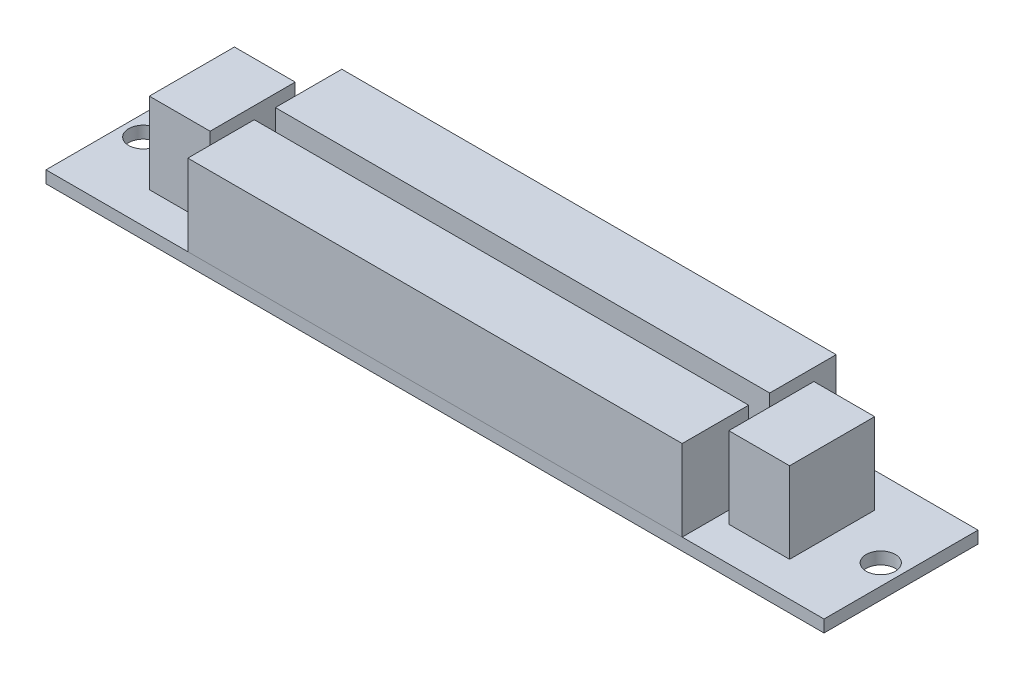
ISO-10303-21;
HEADER;
FILE_DESCRIPTION(('STEP AP214'),'2;1');
FILE_NAME('part.step','',(''),(''),'','','');
FILE_SCHEMA(('AUTOMOTIVE_DESIGN { 1 0 10303 214 1 1 1 1 }'));
ENDSEC;
DATA;
#1=APPLICATION_CONTEXT('core data for automotive mechanical design processes');
#2=APPLICATION_PROTOCOL_DEFINITION('international standard','automotive_design',2000,#1);
#3=PRODUCT_CONTEXT('',#1,'mechanical');
#4=PRODUCT('Part','Part','',(#3));
#5=PRODUCT_RELATED_PRODUCT_CATEGORY('part','',(#4));
#6=PRODUCT_DEFINITION_FORMATION('','',#4);
#7=PRODUCT_DEFINITION_CONTEXT('part definition',#1,'design');
#8=PRODUCT_DEFINITION('design','',#6,#7);
#9=PRODUCT_DEFINITION_SHAPE('','',#8);
#10=(LENGTH_UNIT() NAMED_UNIT(*) SI_UNIT(.MILLI.,.METRE.));
#11=(NAMED_UNIT(*) PLANE_ANGLE_UNIT() SI_UNIT($,.RADIAN.));
#12=(NAMED_UNIT(*) SI_UNIT($,.STERADIAN.) SOLID_ANGLE_UNIT());
#13=UNCERTAINTY_MEASURE_WITH_UNIT(LENGTH_MEASURE(1.E-05),#10,'distance_accuracy_value','');
#14=(GEOMETRIC_REPRESENTATION_CONTEXT(3) GLOBAL_UNCERTAINTY_ASSIGNED_CONTEXT((#13)) GLOBAL_UNIT_ASSIGNED_CONTEXT((#10,
#11,#12)) REPRESENTATION_CONTEXT('',''));
#15=CARTESIAN_POINT('',(0.,0.,0.));
#16=DIRECTION('',(0.,0.,1.));
#17=DIRECTION('',(1.,0.,0.));
#18=AXIS2_PLACEMENT_3D('',#15,#16,#17);
#19=CARTESIAN_POINT('',(8.5,11.5,-19.));
#20=DIRECTION('',(0.,0.,1.));
#21=DIRECTION('',(1.,0.,0.));
#22=AXIS2_PLACEMENT_3D('',#19,#20,#21);
#23=PLANE('',#22);
#24=DIRECTION('',(0.,1.,0.));
#25=VECTOR('',#24,1.);
#26=CARTESIAN_POINT('',(17.5,1.5,-19.));
#27=LINE('',#26,#25);
#28=CARTESIAN_POINT('',(17.5,1.5,-19.));
#29=VERTEX_POINT('',#28);
#30=CARTESIAN_POINT('',(17.5,11.5,-19.));
#31=VERTEX_POINT('',#30);
#32=EDGE_CURVE('E97',#29,#31,#27,.T.);
#33=ORIENTED_EDGE('',*,*,#32,.T.);
#34=DIRECTION('',(-1.,0.,0.));
#35=VECTOR('',#34,1.);
#36=CARTESIAN_POINT('',(8.5,11.5,-19.));
#37=LINE('',#36,#35);
#38=CARTESIAN_POINT('',(78.5,11.5,-19.));
#39=VERTEX_POINT('',#38);
#40=EDGE_CURVE('E102',#39,#31,#37,.T.);
#41=ORIENTED_EDGE('',*,*,#40,.F.);
#42=DIRECTION('',(0.,1.,0.));
#43=VECTOR('',#42,1.);
#44=CARTESIAN_POINT('',(78.5,1.5,-19.));
#45=LINE('',#44,#43);
#46=CARTESIAN_POINT('',(78.5,1.5,-19.));
#47=VERTEX_POINT('',#46);
#48=EDGE_CURVE('E12',#47,#39,#45,.T.);
#49=ORIENTED_EDGE('',*,*,#48,.F.);
#50=DIRECTION('',(-1.,0.,0.));
#51=VECTOR('',#50,1.);
#52=CARTESIAN_POINT('',(8.5,1.5,-19.));
#53=LINE('',#52,#51);
#54=EDGE_CURVE('E107',#47,#29,#53,.T.);
#55=ORIENTED_EDGE('',*,*,#54,.T.);
#56=EDGE_LOOP('',(#33,#41,#49,#55));
#57=FACE_BOUND('',#56,.T.);
#58=ADVANCED_FACE('F54',(#57),#23,.F.);
#59=CARTESIAN_POINT('',(0.,11.5,0.));
#60=DIRECTION('',(0.,1.,0.));
#61=DIRECTION('',(0.,0.,1.));
#62=AXIS2_PLACEMENT_3D('',#59,#60,#61);
#63=PLANE('',#62);
#64=ORIENTED_EDGE('',*,*,#40,.T.);
#65=DIRECTION('',(0.,0.,1.));
#66=VECTOR('',#65,1.);
#67=CARTESIAN_POINT('',(17.5,11.5,0.));
#68=LINE('',#67,#66);
#69=CARTESIAN_POINT('',(17.5,11.5,-10.8));
#70=VERTEX_POINT('',#69);
#71=EDGE_CURVE('E58',#31,#70,#68,.T.);
#72=ORIENTED_EDGE('',*,*,#71,.T.);
#73=DIRECTION('',(-1.,0.,0.));
#74=VECTOR('',#73,1.);
#75=CARTESIAN_POINT('',(0.,11.5,-10.8));
#76=LINE('',#75,#74);
#77=CARTESIAN_POINT('',(78.5,11.5,-10.8));
#78=VERTEX_POINT('',#77);
#79=EDGE_CURVE('E116',#78,#70,#76,.T.);
#80=ORIENTED_EDGE('',*,*,#79,.F.);
#81=DIRECTION('',(0.,0.,1.));
#82=VECTOR('',#81,1.);
#83=CARTESIAN_POINT('',(78.5,11.5,0.));
#84=LINE('',#83,#82);
#85=EDGE_CURVE('E64',#39,#78,#84,.T.);
#86=ORIENTED_EDGE('',*,*,#85,.F.);
#87=EDGE_LOOP('',(#64,#72,#80,#86));
#88=FACE_BOUND('',#87,.T.);
#89=ADVANCED_FACE('F109',(#88),#63,.T.);
#90=CARTESIAN_POINT('',(0.,1.5,0.));
#91=DIRECTION('',(0.,1.,0.));
#92=DIRECTION('',(0.,0.,1.));
#93=AXIS2_PLACEMENT_3D('',#90,#91,#92);
#94=PLANE('',#93);
#95=DIRECTION('',(0.,0.,1.));
#96=VECTOR('',#95,1.);
#97=CARTESIAN_POINT('',(17.5,1.5,0.));
#98=LINE('',#97,#96);
#99=CARTESIAN_POINT('',(17.5,1.5,-10.8));
#100=VERTEX_POINT('',#99);
#101=EDGE_CURVE('E85',#29,#100,#98,.T.);
#102=ORIENTED_EDGE('',*,*,#101,.F.);
#103=ORIENTED_EDGE('',*,*,#54,.F.);
#104=DIRECTION('',(0.,0.,1.));
#105=VECTOR('',#104,1.);
#106=CARTESIAN_POINT('',(78.5,1.5,0.));
#107=LINE('',#106,#105);
#108=CARTESIAN_POINT('',(78.5,1.5,-10.8));
#109=VERTEX_POINT('',#108);
#110=EDGE_CURVE('E101',#47,#109,#107,.T.);
#111=ORIENTED_EDGE('',*,*,#110,.T.);
#112=DIRECTION('',(-1.,0.,0.));
#113=VECTOR('',#112,1.);
#114=CARTESIAN_POINT('',(0.,1.5,-10.8));
#115=LINE('',#114,#113);
#116=EDGE_CURVE('E119',#109,#100,#115,.T.);
#117=ORIENTED_EDGE('',*,*,#116,.T.);
#118=EDGE_LOOP('',(#102,#103,#111,#117));
#119=FACE_BOUND('',#118,.T.);
#120=ADVANCED_FACE('F56',(#119),#94,.F.);
#121=CARTESIAN_POINT('',(17.5,1.5,0.));
#122=DIRECTION('',(-1.,0.,0.));
#123=DIRECTION('',(0.,0.,1.));
#124=AXIS2_PLACEMENT_3D('',#121,#122,#123);
#125=PLANE('',#124);
#126=ORIENTED_EDGE('',*,*,#71,.F.);
#127=ORIENTED_EDGE('',*,*,#32,.F.);
#128=ORIENTED_EDGE('',*,*,#101,.T.);
#129=DIRECTION('',(0.,1.,0.));
#130=VECTOR('',#129,1.);
#131=CARTESIAN_POINT('',(17.5,1.5,-10.8));
#132=LINE('',#131,#130);
#133=EDGE_CURVE('E89',#100,#70,#132,.T.);
#134=ORIENTED_EDGE('',*,*,#133,.T.);
#135=EDGE_LOOP('',(#126,#127,#128,#134));
#136=FACE_BOUND('',#135,.T.);
#137=ADVANCED_FACE('F96',(#136),#125,.T.);
#138=CARTESIAN_POINT('',(0.,1.5,-10.8));
#139=DIRECTION('',(0.,0.,-1.));
#140=DIRECTION('',(-1.,0.,0.));
#141=AXIS2_PLACEMENT_3D('',#138,#139,#140);
#142=PLANE('',#141);
#143=ORIENTED_EDGE('',*,*,#79,.T.);
#144=ORIENTED_EDGE('',*,*,#133,.F.);
#145=ORIENTED_EDGE('',*,*,#116,.F.);
#146=DIRECTION('',(0.,1.,0.));
#147=VECTOR('',#146,1.);
#148=CARTESIAN_POINT('',(78.5,1.5,-10.8));
#149=LINE('',#148,#147);
#150=EDGE_CURVE('E113',#109,#78,#149,.T.);
#151=ORIENTED_EDGE('',*,*,#150,.T.);
#152=EDGE_LOOP('',(#143,#144,#145,#151));
#153=FACE_BOUND('',#152,.T.);
#154=ADVANCED_FACE('F128',(#153),#142,.F.);
#155=CARTESIAN_POINT('',(78.5,1.5,0.));
#156=DIRECTION('',(-1.,0.,0.));
#157=DIRECTION('',(0.,0.,1.));
#158=AXIS2_PLACEMENT_3D('',#155,#156,#157);
#159=PLANE('',#158);
#160=ORIENTED_EDGE('',*,*,#85,.T.);
#161=ORIENTED_EDGE('',*,*,#150,.F.);
#162=ORIENTED_EDGE('',*,*,#110,.F.);
#163=ORIENTED_EDGE('',*,*,#48,.T.);
#164=EDGE_LOOP('',(#160,#161,#162,#163));
#165=FACE_BOUND('',#164,.T.);
#166=ADVANCED_FACE('F126',(#165),#159,.F.);
#167=CLOSED_SHELL('',(#58,#89,#120,#137,#154,#166));
#168=MANIFOLD_SOLID_BREP('B2',#167);
#169=CARTESIAN_POINT('',(0.,11.5,0.));
#170=DIRECTION('',(0.,1.,0.));
#171=DIRECTION('',(0.,0.,1.));
#172=AXIS2_PLACEMENT_3D('',#169,#170,#171);
#173=PLANE('',#172);
#174=DIRECTION('',(0.,0.,-1.));
#175=VECTOR('',#174,1.);
#176=CARTESIAN_POINT('',(16.,11.5,0.));
#177=LINE('',#176,#175);
#178=CARTESIAN_POINT('',(16.,11.5,-4.25));
#179=VERTEX_POINT('',#178);
#180=CARTESIAN_POINT('',(16.,11.5,-14.75));
#181=VERTEX_POINT('',#180);
#182=EDGE_CURVE('E252',#179,#181,#177,.T.);
#183=ORIENTED_EDGE('',*,*,#182,.T.);
#184=DIRECTION('',(-1.,0.,0.));
#185=VECTOR('',#184,1.);
#186=CARTESIAN_POINT('',(0.,11.5,-14.75));
#187=LINE('',#186,#185);
#188=CARTESIAN_POINT('',(8.5,11.5,-14.75));
#189=VERTEX_POINT('',#188);
#190=EDGE_CURVE('E261',#181,#189,#187,.T.);
#191=ORIENTED_EDGE('',*,*,#190,.T.);
#192=DIRECTION('',(0.,0.,1.));
#193=VECTOR('',#192,1.);
#194=CARTESIAN_POINT('',(8.5,11.5,-19.));
#195=LINE('',#194,#193);
#196=CARTESIAN_POINT('',(8.5,11.5,-4.25));
#197=VERTEX_POINT('',#196);
#198=EDGE_CURVE('E244',#189,#197,#195,.T.);
#199=ORIENTED_EDGE('',*,*,#198,.T.);
#200=DIRECTION('',(-1.,0.,0.));
#201=VECTOR('',#200,1.);
#202=CARTESIAN_POINT('',(0.,11.5,-4.25));
#203=LINE('',#202,#201);
#204=EDGE_CURVE('E254',#179,#197,#203,.T.);
#205=ORIENTED_EDGE('',*,*,#204,.F.);
#206=EDGE_LOOP('',(#183,#191,#199,#205));
#207=FACE_BOUND('',#206,.T.);
#208=ADVANCED_FACE('F197',(#207),#173,.T.);
#209=CARTESIAN_POINT('',(0.,1.5,0.));
#210=DIRECTION('',(0.,1.,0.));
#211=DIRECTION('',(0.,0.,1.));
#212=AXIS2_PLACEMENT_3D('',#209,#210,#211);
#213=PLANE('',#212);
#214=DIRECTION('',(-1.,0.,0.));
#215=VECTOR('',#214,1.);
#216=CARTESIAN_POINT('',(0.,1.5,-14.75));
#217=LINE('',#216,#215);
#218=CARTESIAN_POINT('',(16.,1.5,-14.75));
#219=VERTEX_POINT('',#218);
#220=CARTESIAN_POINT('',(8.5,1.5,-14.75));
#221=VERTEX_POINT('',#220);
#222=EDGE_CURVE('E201',#219,#221,#217,.T.);
#223=ORIENTED_EDGE('',*,*,#222,.F.);
#224=DIRECTION('',(0.,0.,-1.));
#225=VECTOR('',#224,1.);
#226=CARTESIAN_POINT('',(16.,1.5,0.));
#227=LINE('',#226,#225);
#228=CARTESIAN_POINT('',(16.,1.5,-4.25));
#229=VERTEX_POINT('',#228);
#230=EDGE_CURVE('E249',#229,#219,#227,.T.);
#231=ORIENTED_EDGE('',*,*,#230,.F.);
#232=DIRECTION('',(-1.,0.,0.));
#233=VECTOR('',#232,1.);
#234=CARTESIAN_POINT('',(0.,1.5,-4.25));
#235=LINE('',#234,#233);
#236=CARTESIAN_POINT('',(8.5,1.5,-4.25));
#237=VERTEX_POINT('',#236);
#238=EDGE_CURVE('E234',#229,#237,#235,.T.);
#239=ORIENTED_EDGE('',*,*,#238,.T.);
#240=DIRECTION('',(0.,0.,1.));
#241=VECTOR('',#240,1.);
#242=CARTESIAN_POINT('',(8.5,1.5,-19.));
#243=LINE('',#242,#241);
#244=EDGE_CURVE('E243',#221,#237,#243,.T.);
#245=ORIENTED_EDGE('',*,*,#244,.F.);
#246=EDGE_LOOP('',(#223,#231,#239,#245));
#247=FACE_BOUND('',#246,.T.);
#248=ADVANCED_FACE('F199',(#247),#213,.F.);
#249=CARTESIAN_POINT('',(8.5,11.5,-19.));
#250=DIRECTION('',(1.,0.,0.));
#251=DIRECTION('',(0.,0.,-1.));
#252=AXIS2_PLACEMENT_3D('',#249,#250,#251);
#253=PLANE('',#252);
#254=DIRECTION('',(0.,1.,0.));
#255=VECTOR('',#254,1.);
#256=CARTESIAN_POINT('',(8.5,1.5,-14.75));
#257=LINE('',#256,#255);
#258=EDGE_CURVE('E52',#221,#189,#257,.T.);
#259=ORIENTED_EDGE('',*,*,#258,.F.);
#260=ORIENTED_EDGE('',*,*,#244,.T.);
#261=DIRECTION('',(0.,1.,0.));
#262=VECTOR('',#261,1.);
#263=CARTESIAN_POINT('',(8.5,1.5,-4.25));
#264=LINE('',#263,#262);
#265=EDGE_CURVE('E232',#237,#197,#264,.T.);
#266=ORIENTED_EDGE('',*,*,#265,.T.);
#267=ORIENTED_EDGE('',*,*,#198,.F.);
#268=EDGE_LOOP('',(#259,#260,#266,#267));
#269=FACE_BOUND('',#268,.T.);
#270=ADVANCED_FACE('F268',(#269),#253,.F.);
#271=CARTESIAN_POINT('',(16.,1.5,0.));
#272=DIRECTION('',(1.,0.,0.));
#273=DIRECTION('',(0.,0.,-1.));
#274=AXIS2_PLACEMENT_3D('',#271,#272,#273);
#275=PLANE('',#274);
#276=ORIENTED_EDGE('',*,*,#182,.F.);
#277=DIRECTION('',(0.,1.,0.));
#278=VECTOR('',#277,1.);
#279=CARTESIAN_POINT('',(16.,1.5,-4.25));
#280=LINE('',#279,#278);
#281=EDGE_CURVE('E237',#229,#179,#280,.T.);
#282=ORIENTED_EDGE('',*,*,#281,.F.);
#283=ORIENTED_EDGE('',*,*,#230,.T.);
#284=DIRECTION('',(0.,1.,0.));
#285=VECTOR('',#284,1.);
#286=CARTESIAN_POINT('',(16.,1.5,-14.75));
#287=LINE('',#286,#285);
#288=EDGE_CURVE('E257',#219,#181,#287,.T.);
#289=ORIENTED_EDGE('',*,*,#288,.T.);
#290=EDGE_LOOP('',(#276,#282,#283,#289));
#291=FACE_BOUND('',#290,.T.);
#292=ADVANCED_FACE('F248',(#291),#275,.T.);
#293=CARTESIAN_POINT('',(0.,1.5,-4.25));
#294=DIRECTION('',(0.,0.,-1.));
#295=DIRECTION('',(-1.,0.,0.));
#296=AXIS2_PLACEMENT_3D('',#293,#294,#295);
#297=PLANE('',#296);
#298=ORIENTED_EDGE('',*,*,#204,.T.);
#299=ORIENTED_EDGE('',*,*,#265,.F.);
#300=ORIENTED_EDGE('',*,*,#238,.F.);
#301=ORIENTED_EDGE('',*,*,#281,.T.);
#302=EDGE_LOOP('',(#298,#299,#300,#301));
#303=FACE_BOUND('',#302,.T.);
#304=ADVANCED_FACE('F236',(#303),#297,.F.);
#305=CARTESIAN_POINT('',(0.,1.5,-14.75));
#306=DIRECTION('',(0.,0.,-1.));
#307=DIRECTION('',(-1.,0.,0.));
#308=AXIS2_PLACEMENT_3D('',#305,#306,#307);
#309=PLANE('',#308);
#310=ORIENTED_EDGE('',*,*,#190,.F.);
#311=ORIENTED_EDGE('',*,*,#288,.F.);
#312=ORIENTED_EDGE('',*,*,#222,.T.);
#313=ORIENTED_EDGE('',*,*,#258,.T.);
#314=EDGE_LOOP('',(#310,#311,#312,#313));
#315=FACE_BOUND('',#314,.T.);
#316=ADVANCED_FACE('F271',(#315),#309,.T.);
#317=CLOSED_SHELL('',(#208,#248,#270,#292,#304,#316));
#318=MANIFOLD_SOLID_BREP('B6',#317);
#319=CARTESIAN_POINT('',(0.,11.5,0.));
#320=DIRECTION('',(0.,1.,0.));
#321=DIRECTION('',(0.,0.,1.));
#322=AXIS2_PLACEMENT_3D('',#319,#320,#321);
#323=PLANE('',#322);
#324=DIRECTION('',(0.,0.,1.));
#325=VECTOR('',#324,1.);
#326=CARTESIAN_POINT('',(78.5,11.5,0.));
#327=LINE('',#326,#325);
#328=CARTESIAN_POINT('',(78.5,11.5,-8.2));
#329=VERTEX_POINT('',#328);
#330=CARTESIAN_POINT('',(78.5,11.5,0.));
#331=VERTEX_POINT('',#330);
#332=EDGE_CURVE('E347',#329,#331,#327,.T.);
#333=ORIENTED_EDGE('',*,*,#332,.F.);
#334=DIRECTION('',(-1.,0.,0.));
#335=VECTOR('',#334,1.);
#336=CARTESIAN_POINT('',(0.,11.5,-8.2));
#337=LINE('',#336,#335);
#338=CARTESIAN_POINT('',(17.5,11.5,-8.2));
#339=VERTEX_POINT('',#338);
#340=EDGE_CURVE('E376',#329,#339,#337,.T.);
#341=ORIENTED_EDGE('',*,*,#340,.T.);
#342=DIRECTION('',(0.,0.,1.));
#343=VECTOR('',#342,1.);
#344=CARTESIAN_POINT('',(17.5,11.5,0.));
#345=LINE('',#344,#343);
#346=CARTESIAN_POINT('',(17.5,11.5,0.));
#347=VERTEX_POINT('',#346);
#348=EDGE_CURVE('E395',#339,#347,#345,.T.);
#349=ORIENTED_EDGE('',*,*,#348,.T.);
#350=DIRECTION('',(1.,0.,0.));
#351=VECTOR('',#350,1.);
#352=CARTESIAN_POINT('',(8.5,11.5,0.));
#353=LINE('',#352,#351);
#354=EDGE_CURVE('E386',#347,#331,#353,.T.);
#355=ORIENTED_EDGE('',*,*,#354,.T.);
#356=EDGE_LOOP('',(#333,#341,#349,#355));
#357=FACE_BOUND('',#356,.T.);
#358=ADVANCED_FACE('F337',(#357),#323,.T.);
#359=CARTESIAN_POINT('',(0.,1.5,0.));
#360=DIRECTION('',(0.,1.,0.));
#361=DIRECTION('',(0.,0.,1.));
#362=AXIS2_PLACEMENT_3D('',#359,#360,#361);
#363=PLANE('',#362);
#364=DIRECTION('',(-1.,0.,0.));
#365=VECTOR('',#364,1.);
#366=CARTESIAN_POINT('',(0.,1.5,-8.2));
#367=LINE('',#366,#365);
#368=CARTESIAN_POINT('',(78.5,1.5,-8.2));
#369=VERTEX_POINT('',#368);
#370=CARTESIAN_POINT('',(17.5,1.5,-8.2));
#371=VERTEX_POINT('',#370);
#372=EDGE_CURVE('E373',#369,#371,#367,.T.);
#373=ORIENTED_EDGE('',*,*,#372,.F.);
#374=DIRECTION('',(0.,0.,1.));
#375=VECTOR('',#374,1.);
#376=CARTESIAN_POINT('',(78.5,1.5,0.));
#377=LINE('',#376,#375);
#378=CARTESIAN_POINT('',(78.5,1.5,0.));
#379=VERTEX_POINT('',#378);
#380=EDGE_CURVE('E379',#369,#379,#377,.T.);
#381=ORIENTED_EDGE('',*,*,#380,.T.);
#382=DIRECTION('',(1.,0.,0.));
#383=VECTOR('',#382,1.);
#384=CARTESIAN_POINT('',(8.5,1.5,0.));
#385=LINE('',#384,#383);
#386=CARTESIAN_POINT('',(17.5,1.5,0.));
#387=VERTEX_POINT('',#386);
#388=EDGE_CURVE('E385',#387,#379,#385,.T.);
#389=ORIENTED_EDGE('',*,*,#388,.F.);
#390=DIRECTION('',(0.,0.,1.));
#391=VECTOR('',#390,1.);
#392=CARTESIAN_POINT('',(17.5,1.5,0.));
#393=LINE('',#392,#391);
#394=EDGE_CURVE('E341',#371,#387,#393,.T.);
#395=ORIENTED_EDGE('',*,*,#394,.F.);
#396=EDGE_LOOP('',(#373,#381,#389,#395));
#397=FACE_BOUND('',#396,.T.);
#398=ADVANCED_FACE('F388',(#397),#363,.F.);
#399=CARTESIAN_POINT('',(8.5,11.5,0.));
#400=DIRECTION('',(0.,0.,-1.));
#401=DIRECTION('',(-1.,0.,0.));
#402=AXIS2_PLACEMENT_3D('',#399,#400,#401);
#403=PLANE('',#402);
#404=ORIENTED_EDGE('',*,*,#388,.T.);
#405=DIRECTION('',(0.,1.,0.));
#406=VECTOR('',#405,1.);
#407=CARTESIAN_POINT('',(78.5,1.5,0.));
#408=LINE('',#407,#406);
#409=EDGE_CURVE('E381',#379,#331,#408,.T.);
#410=ORIENTED_EDGE('',*,*,#409,.T.);
#411=ORIENTED_EDGE('',*,*,#354,.F.);
#412=DIRECTION('',(0.,1.,0.));
#413=VECTOR('',#412,1.);
#414=CARTESIAN_POINT('',(17.5,1.5,0.));
#415=LINE('',#414,#413);
#416=EDGE_CURVE('E391',#387,#347,#415,.T.);
#417=ORIENTED_EDGE('',*,*,#416,.F.);
#418=EDGE_LOOP('',(#404,#410,#411,#417));
#419=FACE_BOUND('',#418,.T.);
#420=ADVANCED_FACE('F405',(#419),#403,.F.);
#421=CARTESIAN_POINT('',(17.5,1.5,0.));
#422=DIRECTION('',(-1.,0.,0.));
#423=DIRECTION('',(0.,0.,1.));
#424=AXIS2_PLACEMENT_3D('',#421,#422,#423);
#425=PLANE('',#424);
#426=ORIENTED_EDGE('',*,*,#348,.F.);
#427=DIRECTION('',(0.,1.,0.));
#428=VECTOR('',#427,1.);
#429=CARTESIAN_POINT('',(17.5,1.5,-8.2));
#430=LINE('',#429,#428);
#431=EDGE_CURVE('E390',#371,#339,#430,.T.);
#432=ORIENTED_EDGE('',*,*,#431,.F.);
#433=ORIENTED_EDGE('',*,*,#394,.T.);
#434=ORIENTED_EDGE('',*,*,#416,.T.);
#435=EDGE_LOOP('',(#426,#432,#433,#434));
#436=FACE_BOUND('',#435,.T.);
#437=ADVANCED_FACE('F410',(#436),#425,.T.);
#438=CARTESIAN_POINT('',(0.,1.5,-8.2));
#439=DIRECTION('',(0.,0.,-1.));
#440=DIRECTION('',(-1.,0.,0.));
#441=AXIS2_PLACEMENT_3D('',#438,#439,#440);
#442=PLANE('',#441);
#443=ORIENTED_EDGE('',*,*,#340,.F.);
#444=DIRECTION('',(0.,1.,0.));
#445=VECTOR('',#444,1.);
#446=CARTESIAN_POINT('',(78.5,1.5,-8.2));
#447=LINE('',#446,#445);
#448=EDGE_CURVE('E195',#369,#329,#447,.T.);
#449=ORIENTED_EDGE('',*,*,#448,.F.);
#450=ORIENTED_EDGE('',*,*,#372,.T.);
#451=ORIENTED_EDGE('',*,*,#431,.T.);
#452=EDGE_LOOP('',(#443,#449,#450,#451));
#453=FACE_BOUND('',#452,.T.);
#454=ADVANCED_FACE('F370',(#453),#442,.T.);
#455=CARTESIAN_POINT('',(78.5,1.5,0.));
#456=DIRECTION('',(-1.,0.,0.));
#457=DIRECTION('',(0.,0.,1.));
#458=AXIS2_PLACEMENT_3D('',#455,#456,#457);
#459=PLANE('',#458);
#460=ORIENTED_EDGE('',*,*,#332,.T.);
#461=ORIENTED_EDGE('',*,*,#409,.F.);
#462=ORIENTED_EDGE('',*,*,#380,.F.);
#463=ORIENTED_EDGE('',*,*,#448,.T.);
#464=EDGE_LOOP('',(#460,#461,#462,#463));
#465=FACE_BOUND('',#464,.T.);
#466=ADVANCED_FACE('F339',(#465),#459,.F.);
#467=CLOSED_SHELL('',(#358,#398,#420,#437,#454,#466));
#468=MANIFOLD_SOLID_BREP('B46',#467);
#469=CARTESIAN_POINT('',(0.,11.5,0.));
#470=DIRECTION('',(0.,1.,0.));
#471=DIRECTION('',(0.,0.,1.));
#472=AXIS2_PLACEMENT_3D('',#469,#470,#471);
#473=PLANE('',#472);
#474=DIRECTION('',(1.,0.,0.));
#475=VECTOR('',#474,1.);
#476=CARTESIAN_POINT('',(0.,11.5,-14.7500000000001));
#477=LINE('',#476,#475);
#478=CARTESIAN_POINT('',(80.,11.5,-14.75));
#479=VERTEX_POINT('',#478);
#480=CARTESIAN_POINT('',(87.5,11.5,-14.75));
#481=VERTEX_POINT('',#480);
#482=EDGE_CURVE('E519',#479,#481,#477,.T.);
#483=ORIENTED_EDGE('',*,*,#482,.F.);
#484=DIRECTION('',(0.,0.,1.));
#485=VECTOR('',#484,1.);
#486=CARTESIAN_POINT('',(80.,11.5,0.));
#487=LINE('',#486,#485);
#488=CARTESIAN_POINT('',(80.,11.5,-4.24999999999998));
#489=VERTEX_POINT('',#488);
#490=EDGE_CURVE('E547',#479,#489,#487,.T.);
#491=ORIENTED_EDGE('',*,*,#490,.T.);
#492=DIRECTION('',(1.,0.,0.));
#493=VECTOR('',#492,1.);
#494=CARTESIAN_POINT('',(0.,11.5,-4.25000000000002));
#495=LINE('',#494,#493);
#496=CARTESIAN_POINT('',(87.5,11.5,-4.24999999999997));
#497=VERTEX_POINT('',#496);
#498=EDGE_CURVE('E548',#489,#497,#495,.T.);
#499=ORIENTED_EDGE('',*,*,#498,.T.);
#500=DIRECTION('',(0.,0.,-1.));
#501=VECTOR('',#500,1.);
#502=CARTESIAN_POINT('',(87.5,11.5,-19.));
#503=LINE('',#502,#501);
#504=EDGE_CURVE('E335',#497,#481,#503,.T.);
#505=ORIENTED_EDGE('',*,*,#504,.T.);
#506=EDGE_LOOP('',(#483,#491,#499,#505));
#507=FACE_BOUND('',#506,.T.);
#508=ADVANCED_FACE('F479',(#507),#473,.T.);
#509=CARTESIAN_POINT('',(0.,1.5,0.));
#510=DIRECTION('',(0.,1.,0.));
#511=DIRECTION('',(0.,0.,1.));
#512=AXIS2_PLACEMENT_3D('',#509,#510,#511);
#513=PLANE('',#512);
#514=DIRECTION('',(0.,0.,1.));
#515=VECTOR('',#514,1.);
#516=CARTESIAN_POINT('',(80.,1.5,0.));
#517=LINE('',#516,#515);
#518=CARTESIAN_POINT('',(80.,1.5,-14.75));
#519=VERTEX_POINT('',#518);
#520=CARTESIAN_POINT('',(80.,1.5,-4.24999999999998));
#521=VERTEX_POINT('',#520);
#522=EDGE_CURVE('E529',#519,#521,#517,.T.);
#523=ORIENTED_EDGE('',*,*,#522,.F.);
#524=DIRECTION('',(1.,0.,0.));
#525=VECTOR('',#524,1.);
#526=CARTESIAN_POINT('',(0.,1.5,-14.7500000000001));
#527=LINE('',#526,#525);
#528=CARTESIAN_POINT('',(87.5,1.5,-14.75));
#529=VERTEX_POINT('',#528);
#530=EDGE_CURVE('E534',#519,#529,#527,.T.);
#531=ORIENTED_EDGE('',*,*,#530,.T.);
#532=DIRECTION('',(0.,0.,-1.));
#533=VECTOR('',#532,1.);
#534=CARTESIAN_POINT('',(87.5,1.5,-19.));
#535=LINE('',#534,#533);
#536=CARTESIAN_POINT('',(87.5,1.5,-4.24999999999997));
#537=VERTEX_POINT('',#536);
#538=EDGE_CURVE('E483',#537,#529,#535,.T.);
#539=ORIENTED_EDGE('',*,*,#538,.F.);
#540=DIRECTION('',(1.,0.,0.));
#541=VECTOR('',#540,1.);
#542=CARTESIAN_POINT('',(0.,1.5,-4.25000000000002));
#543=LINE('',#542,#541);
#544=EDGE_CURVE('E521',#521,#537,#543,.T.);
#545=ORIENTED_EDGE('',*,*,#544,.F.);
#546=EDGE_LOOP('',(#523,#531,#539,#545));
#547=FACE_BOUND('',#546,.T.);
#548=ADVANCED_FACE('F536',(#547),#513,.F.);
#549=CARTESIAN_POINT('',(87.5,11.5,-19.));
#550=DIRECTION('',(-1.,0.,0.));
#551=DIRECTION('',(0.,0.,1.));
#552=AXIS2_PLACEMENT_3D('',#549,#550,#551);
#553=PLANE('',#552);
#554=ORIENTED_EDGE('',*,*,#538,.T.);
#555=DIRECTION('',(0.,1.,0.));
#556=VECTOR('',#555,1.);
#557=CARTESIAN_POINT('',(87.5,1.5,-14.75));
#558=LINE('',#557,#556);
#559=EDGE_CURVE('E503',#529,#481,#558,.T.);
#560=ORIENTED_EDGE('',*,*,#559,.T.);
#561=ORIENTED_EDGE('',*,*,#504,.F.);
#562=DIRECTION('',(0.,1.,0.));
#563=VECTOR('',#562,1.);
#564=CARTESIAN_POINT('',(87.5,1.5,-4.24999999999997));
#565=LINE('',#564,#563);
#566=EDGE_CURVE('E524',#537,#497,#565,.T.);
#567=ORIENTED_EDGE('',*,*,#566,.F.);
#568=EDGE_LOOP('',(#554,#560,#561,#567));
#569=FACE_BOUND('',#568,.T.);
#570=ADVANCED_FACE('F481',(#569),#553,.F.);
#571=CARTESIAN_POINT('',(0.,1.5,-4.25000000000002));
#572=DIRECTION('',(0.,0.,1.));
#573=DIRECTION('',(1.,0.,0.));
#574=AXIS2_PLACEMENT_3D('',#571,#572,#573);
#575=PLANE('',#574);
#576=ORIENTED_EDGE('',*,*,#498,.F.);
#577=DIRECTION('',(0.,1.,0.));
#578=VECTOR('',#577,1.);
#579=CARTESIAN_POINT('',(80.,1.5,-4.24999999999998));
#580=LINE('',#579,#578);
#581=EDGE_CURVE('E494',#521,#489,#580,.T.);
#582=ORIENTED_EDGE('',*,*,#581,.F.);
#583=ORIENTED_EDGE('',*,*,#544,.T.);
#584=ORIENTED_EDGE('',*,*,#566,.T.);
#585=EDGE_LOOP('',(#576,#582,#583,#584));
#586=FACE_BOUND('',#585,.T.);
#587=ADVANCED_FACE('F523',(#586),#575,.T.);
#588=CARTESIAN_POINT('',(80.,1.5,0.));
#589=DIRECTION('',(-1.,0.,0.));
#590=DIRECTION('',(0.,0.,1.));
#591=AXIS2_PLACEMENT_3D('',#588,#589,#590);
#592=PLANE('',#591);
#593=ORIENTED_EDGE('',*,*,#490,.F.);
#594=DIRECTION('',(0.,1.,0.));
#595=VECTOR('',#594,1.);
#596=CARTESIAN_POINT('',(80.,1.5,-14.75));
#597=LINE('',#596,#595);
#598=EDGE_CURVE('E537',#519,#479,#597,.T.);
#599=ORIENTED_EDGE('',*,*,#598,.F.);
#600=ORIENTED_EDGE('',*,*,#522,.T.);
#601=ORIENTED_EDGE('',*,*,#581,.T.);
#602=EDGE_LOOP('',(#593,#599,#600,#601));
#603=FACE_BOUND('',#602,.T.);
#604=ADVANCED_FACE('F545',(#603),#592,.T.);
#605=CARTESIAN_POINT('',(0.,1.5,-14.7500000000001));
#606=DIRECTION('',(0.,0.,1.));
#607=DIRECTION('',(1.,0.,0.));
#608=AXIS2_PLACEMENT_3D('',#605,#606,#607);
#609=PLANE('',#608);
#610=ORIENTED_EDGE('',*,*,#482,.T.);
#611=ORIENTED_EDGE('',*,*,#559,.F.);
#612=ORIENTED_EDGE('',*,*,#530,.F.);
#613=ORIENTED_EDGE('',*,*,#598,.T.);
#614=EDGE_LOOP('',(#610,#611,#612,#613));
#615=FACE_BOUND('',#614,.T.);
#616=ADVANCED_FACE('F563',(#615),#609,.F.);
#617=CLOSED_SHELL('',(#508,#548,#570,#587,#604,#616));
#618=MANIFOLD_SOLID_BREP('B189',#617);
#619=CARTESIAN_POINT('',(0.,1.5,0.));
#620=DIRECTION('',(1.,0.,0.));
#621=DIRECTION('',(0.,0.,-1.));
#622=AXIS2_PLACEMENT_3D('',#619,#620,#621);
#623=PLANE('',#622);
#624=DIRECTION('',(0.,0.,1.));
#625=VECTOR('',#624,1.);
#626=CARTESIAN_POINT('',(0.,0.,0.));
#627=LINE('',#626,#625);
#628=CARTESIAN_POINT('',(0.,0.,-19.));
#629=VERTEX_POINT('',#628);
#630=CARTESIAN_POINT('',(0.,0.,0.));
#631=VERTEX_POINT('',#630);
#632=EDGE_CURVE('E673',#629,#631,#627,.T.);
#633=ORIENTED_EDGE('',*,*,#632,.T.);
#634=DIRECTION('',(0.,-1.,0.));
#635=VECTOR('',#634,1.);
#636=CARTESIAN_POINT('',(0.,1.5,0.));
#637=LINE('',#636,#635);
#638=CARTESIAN_POINT('',(0.,1.5,0.));
#639=VERTEX_POINT('',#638);
#640=EDGE_CURVE('E477',#639,#631,#637,.T.);
#641=ORIENTED_EDGE('',*,*,#640,.F.);
#642=DIRECTION('',(0.,0.,1.));
#643=VECTOR('',#642,1.);
#644=CARTESIAN_POINT('',(0.,1.5,0.));
#645=LINE('',#644,#643);
#646=CARTESIAN_POINT('',(0.,1.5,-19.));
#647=VERTEX_POINT('',#646);
#648=EDGE_CURVE('E661',#647,#639,#645,.T.);
#649=ORIENTED_EDGE('',*,*,#648,.F.);
#650=DIRECTION('',(0.,-1.,0.));
#651=VECTOR('',#650,1.);
#652=CARTESIAN_POINT('',(0.,1.5,-19.));
#653=LINE('',#652,#651);
#654=EDGE_CURVE('E669',#647,#629,#653,.T.);
#655=ORIENTED_EDGE('',*,*,#654,.T.);
#656=EDGE_LOOP('',(#633,#641,#649,#655));
#657=FACE_BOUND('',#656,.T.);
#658=ADVANCED_FACE('F609',(#657),#623,.F.);
#659=CARTESIAN_POINT('',(0.,1.5,0.));
#660=DIRECTION('',(0.,0.,-1.));
#661=DIRECTION('',(-1.,0.,0.));
#662=AXIS2_PLACEMENT_3D('',#659,#660,#661);
#663=PLANE('',#662);
#664=DIRECTION('',(1.,0.,0.));
#665=VECTOR('',#664,1.);
#666=CARTESIAN_POINT('',(0.,0.,0.));
#667=LINE('',#666,#665);
#668=CARTESIAN_POINT('',(96.,0.,0.));
#669=VERTEX_POINT('',#668);
#670=EDGE_CURVE('E665',#631,#669,#667,.T.);
#671=ORIENTED_EDGE('',*,*,#670,.T.);
#672=DIRECTION('',(0.,-1.,0.));
#673=VECTOR('',#672,1.);
#674=CARTESIAN_POINT('',(96.,1.5,0.));
#675=LINE('',#674,#673);
#676=CARTESIAN_POINT('',(96.,1.5,0.));
#677=VERTEX_POINT('',#676);
#678=EDGE_CURVE('E617',#677,#669,#675,.T.);
#679=ORIENTED_EDGE('',*,*,#678,.F.);
#680=DIRECTION('',(1.,0.,0.));
#681=VECTOR('',#680,1.);
#682=CARTESIAN_POINT('',(0.,1.5,0.));
#683=LINE('',#682,#681);
#684=EDGE_CURVE('E655',#639,#677,#683,.T.);
#685=ORIENTED_EDGE('',*,*,#684,.F.);
#686=ORIENTED_EDGE('',*,*,#640,.T.);
#687=EDGE_LOOP('',(#671,#679,#685,#686));
#688=FACE_BOUND('',#687,.T.);
#689=ADVANCED_FACE('F664',(#688),#663,.F.);
#690=CARTESIAN_POINT('',(96.,1.5,0.));
#691=DIRECTION('',(-1.,0.,0.));
#692=DIRECTION('',(0.,0.,1.));
#693=AXIS2_PLACEMENT_3D('',#690,#691,#692);
#694=PLANE('',#693);
#695=DIRECTION('',(0.,0.,-1.));
#696=VECTOR('',#695,1.);
#697=CARTESIAN_POINT('',(96.,0.,0.));
#698=LINE('',#697,#696);
#699=CARTESIAN_POINT('',(96.,0.,-19.));
#700=VERTEX_POINT('',#699);
#701=EDGE_CURVE('E642',#669,#700,#698,.T.);
#702=ORIENTED_EDGE('',*,*,#701,.T.);
#703=DIRECTION('',(0.,-1.,0.));
#704=VECTOR('',#703,1.);
#705=CARTESIAN_POINT('',(96.,1.5,-19.));
#706=LINE('',#705,#704);
#707=CARTESIAN_POINT('',(96.,1.5,-19.));
#708=VERTEX_POINT('',#707);
#709=EDGE_CURVE('E666',#708,#700,#706,.T.);
#710=ORIENTED_EDGE('',*,*,#709,.F.);
#711=DIRECTION('',(0.,0.,-1.));
#712=VECTOR('',#711,1.);
#713=CARTESIAN_POINT('',(96.,1.5,0.));
#714=LINE('',#713,#712);
#715=EDGE_CURVE('E659',#677,#708,#714,.T.);
#716=ORIENTED_EDGE('',*,*,#715,.F.);
#717=ORIENTED_EDGE('',*,*,#678,.T.);
#718=EDGE_LOOP('',(#702,#710,#716,#717));
#719=FACE_BOUND('',#718,.T.);
#720=ADVANCED_FACE('F667',(#719),#694,.F.);
#721=CARTESIAN_POINT('',(0.,1.5,-19.));
#722=DIRECTION('',(0.,0.,1.));
#723=DIRECTION('',(1.,0.,0.));
#724=AXIS2_PLACEMENT_3D('',#721,#722,#723);
#725=PLANE('',#724);
#726=DIRECTION('',(-1.,0.,0.));
#727=VECTOR('',#726,1.);
#728=CARTESIAN_POINT('',(0.,0.,-19.));
#729=LINE('',#728,#727);
#730=EDGE_CURVE('E648',#700,#629,#729,.T.);
#731=ORIENTED_EDGE('',*,*,#730,.T.);
#732=ORIENTED_EDGE('',*,*,#654,.F.);
#733=DIRECTION('',(-1.,0.,0.));
#734=VECTOR('',#733,1.);
#735=CARTESIAN_POINT('',(0.,1.5,-19.));
#736=LINE('',#735,#734);
#737=EDGE_CURVE('E625',#708,#647,#736,.T.);
#738=ORIENTED_EDGE('',*,*,#737,.F.);
#739=ORIENTED_EDGE('',*,*,#709,.T.);
#740=EDGE_LOOP('',(#731,#732,#738,#739));
#741=FACE_BOUND('',#740,.T.);
#742=ADVANCED_FACE('F681',(#741),#725,.F.);
#743=CARTESIAN_POINT('',(0.,1.5,0.));
#744=DIRECTION('',(0.,-1.,0.));
#745=DIRECTION('',(0.,0.,-1.));
#746=AXIS2_PLACEMENT_3D('',#743,#744,#745);
#747=PLANE('',#746);
#748=ORIENTED_EDGE('',*,*,#737,.T.);
#749=ORIENTED_EDGE('',*,*,#648,.T.);
#750=ORIENTED_EDGE('',*,*,#684,.T.);
#751=ORIENTED_EDGE('',*,*,#715,.T.);
#752=EDGE_LOOP('',(#748,#749,#750,#751));
#753=FACE_BOUND('',#752,.T.);
#754=CARTESIAN_POINT('',(2.50000000000001,1.5,-9.50000000000001));
#755=DIRECTION('',(0.,1.,0.));
#756=DIRECTION('',(0.,0.,1.));
#757=AXIS2_PLACEMENT_3D('',#754,#755,#756);
#758=CIRCLE('',#757,1.79999999999999);
#759=CARTESIAN_POINT('',(2.50000000000001,1.5,-7.70000000000002));
#760=VERTEX_POINT('',#759);
#761=EDGE_CURVE('E689',#760,#760,#758,.T.);
#762=ORIENTED_EDGE('',*,*,#761,.F.);
#763=EDGE_LOOP('',(#762));
#764=FACE_BOUND('',#763,.T.);
#765=CARTESIAN_POINT('',(93.5,1.5,-9.50000000000002));
#766=DIRECTION('',(0.,1.,0.));
#767=DIRECTION('',(0.,0.,1.));
#768=AXIS2_PLACEMENT_3D('',#765,#766,#767);
#769=CIRCLE('',#768,1.79999999999998);
#770=CARTESIAN_POINT('',(93.5,1.5,-7.70000000000004));
#771=VERTEX_POINT('',#770);
#772=EDGE_CURVE('E695',#771,#771,#769,.T.);
#773=ORIENTED_EDGE('',*,*,#772,.F.);
#774=EDGE_LOOP('',(#773));
#775=FACE_BOUND('',#774,.T.);
#776=ADVANCED_FACE('F656',(#753,#764,#775),#747,.F.);
#777=CARTESIAN_POINT('',(0.,0.,0.));
#778=DIRECTION('',(0.,-1.,0.));
#779=DIRECTION('',(0.,0.,-1.));
#780=AXIS2_PLACEMENT_3D('',#777,#778,#779);
#781=PLANE('',#780);
#782=CARTESIAN_POINT('',(93.5,0.,-9.50000000000002));
#783=DIRECTION('',(0.,1.,0.));
#784=DIRECTION('',(0.,0.,1.));
#785=AXIS2_PLACEMENT_3D('',#782,#783,#784);
#786=CIRCLE('',#785,1.8);
#787=CARTESIAN_POINT('',(93.5,0.,-7.70000000000002));
#788=VERTEX_POINT('',#787);
#789=EDGE_CURVE('E692',#788,#788,#786,.T.);
#790=ORIENTED_EDGE('',*,*,#789,.T.);
#791=EDGE_LOOP('',(#790));
#792=FACE_BOUND('',#791,.T.);
#793=CARTESIAN_POINT('',(2.50000000000001,0.,-9.50000000000001));
#794=DIRECTION('',(0.,1.,0.));
#795=DIRECTION('',(0.,0.,1.));
#796=AXIS2_PLACEMENT_3D('',#793,#794,#795);
#797=CIRCLE('',#796,1.8);
#798=CARTESIAN_POINT('',(2.50000000000001,0.,-7.70000000000001));
#799=VERTEX_POINT('',#798);
#800=EDGE_CURVE('E676',#799,#799,#797,.T.);
#801=ORIENTED_EDGE('',*,*,#800,.T.);
#802=EDGE_LOOP('',(#801));
#803=FACE_BOUND('',#802,.T.);
#804=ORIENTED_EDGE('',*,*,#632,.F.);
#805=ORIENTED_EDGE('',*,*,#730,.F.);
#806=ORIENTED_EDGE('',*,*,#701,.F.);
#807=ORIENTED_EDGE('',*,*,#670,.F.);
#808=EDGE_LOOP('',(#804,#805,#806,#807));
#809=FACE_BOUND('',#808,.T.);
#810=ADVANCED_FACE('F684',(#792,#803,#809),#781,.T.);
#811=CARTESIAN_POINT('',(2.50000000000001,1.5,-9.50000000000001));
#812=DIRECTION('',(0.,1.,0.));
#813=DIRECTION('',(0.,0.,1.));
#814=AXIS2_PLACEMENT_3D('',#811,#812,#813);
#815=CYLINDRICAL_SURFACE('',#814,1.79999999999999);
#816=ORIENTED_EDGE('',*,*,#800,.F.);
#817=EDGE_LOOP('',(#816));
#818=FACE_BOUND('',#817,.T.);
#819=ORIENTED_EDGE('',*,*,#761,.T.);
#820=EDGE_LOOP('',(#819));
#821=FACE_BOUND('',#820,.T.);
#822=ADVANCED_FACE('F709',(#818,#821),#815,.F.);
#823=CARTESIAN_POINT('',(93.5,1.5,-9.50000000000002));
#824=DIRECTION('',(0.,1.,0.));
#825=DIRECTION('',(0.,0.,1.));
#826=AXIS2_PLACEMENT_3D('',#823,#824,#825);
#827=CYLINDRICAL_SURFACE('',#826,1.79999999999999);
#828=ORIENTED_EDGE('',*,*,#789,.F.);
#829=EDGE_LOOP('',(#828));
#830=FACE_BOUND('',#829,.T.);
#831=ORIENTED_EDGE('',*,*,#772,.T.);
#832=EDGE_LOOP('',(#831));
#833=FACE_BOUND('',#832,.T.);
#834=ADVANCED_FACE('F699',(#830,#833),#827,.F.);
#835=CLOSED_SHELL('',(#658,#689,#720,#742,#776,#810,#822,#834));
#836=MANIFOLD_SOLID_BREP('B329',#835);
#837=ADVANCED_BREP_SHAPE_REPRESENTATION('',(#18,#168,#318,#468,#618,#836),#14);
#838=SHAPE_DEFINITION_REPRESENTATION(#9,#837);
ENDSEC;
END-ISO-10303-21;
